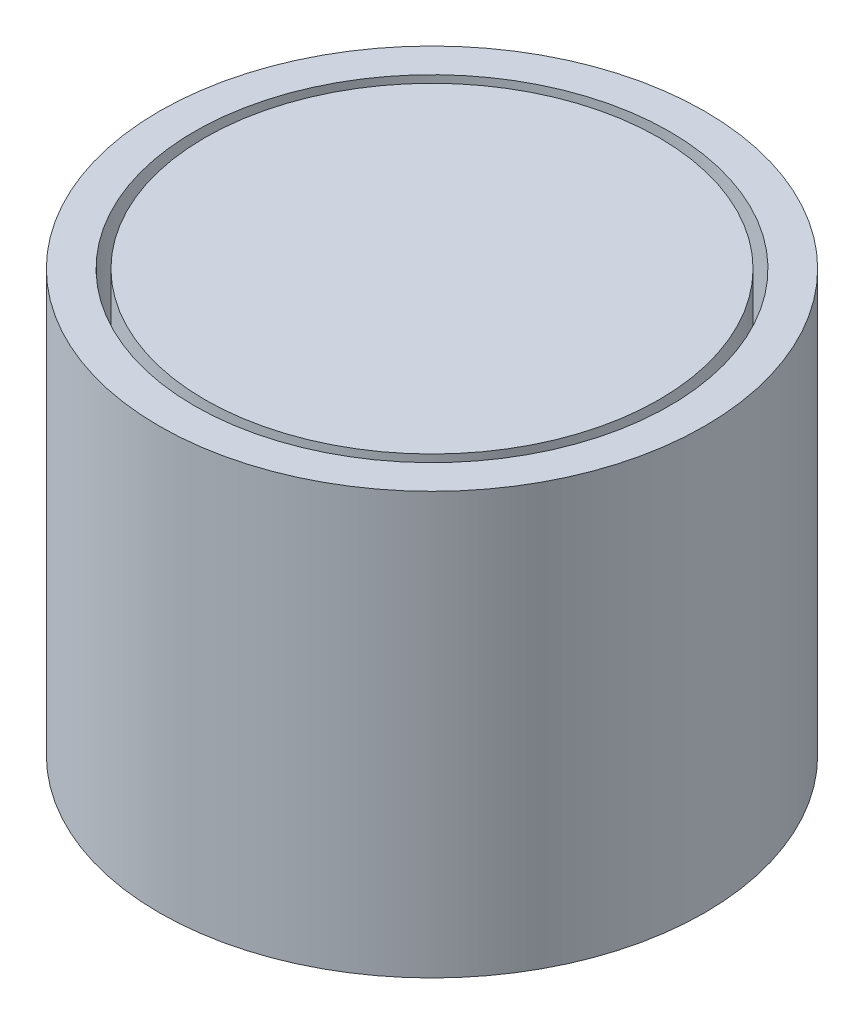
ISO-10303-21;
HEADER;
FILE_DESCRIPTION(('STEP AP214'),'2;1');
FILE_NAME('part.step','',(''),(''),'','','');
FILE_SCHEMA(('AUTOMOTIVE_DESIGN { 1 0 10303 214 1 1 1 1 }'));
ENDSEC;
DATA;
#1=APPLICATION_CONTEXT('core data for automotive mechanical design processes');
#2=APPLICATION_PROTOCOL_DEFINITION('international standard','automotive_design',2000,#1);
#3=PRODUCT_CONTEXT('',#1,'mechanical');
#4=PRODUCT('Part','Part','',(#3));
#5=PRODUCT_RELATED_PRODUCT_CATEGORY('part','',(#4));
#6=PRODUCT_DEFINITION_FORMATION('','',#4);
#7=PRODUCT_DEFINITION_CONTEXT('part definition',#1,'design');
#8=PRODUCT_DEFINITION('design','',#6,#7);
#9=PRODUCT_DEFINITION_SHAPE('','',#8);
#10=(LENGTH_UNIT() NAMED_UNIT(*) SI_UNIT(.MILLI.,.METRE.));
#11=(NAMED_UNIT(*) PLANE_ANGLE_UNIT() SI_UNIT($,.RADIAN.));
#12=(NAMED_UNIT(*) SI_UNIT($,.STERADIAN.) SOLID_ANGLE_UNIT());
#13=UNCERTAINTY_MEASURE_WITH_UNIT(LENGTH_MEASURE(1.E-05),#10,'distance_accuracy_value','');
#14=(GEOMETRIC_REPRESENTATION_CONTEXT(3) GLOBAL_UNCERTAINTY_ASSIGNED_CONTEXT((#13)) GLOBAL_UNIT_ASSIGNED_CONTEXT((#10,
#11,#12)) REPRESENTATION_CONTEXT('',''));
#15=CARTESIAN_POINT('',(0.,0.,0.));
#16=DIRECTION('',(0.,0.,1.));
#17=DIRECTION('',(1.,0.,0.));
#18=AXIS2_PLACEMENT_3D('',#15,#16,#17);
#19=CARTESIAN_POINT('',(0.,17.,0.));
#20=DIRECTION('',(0.,-1.,0.));
#21=DIRECTION('',(0.,0.,-1.));
#22=AXIS2_PLACEMENT_3D('',#19,#20,#21);
#23=CYLINDRICAL_SURFACE('',#22,11.);
#24=CARTESIAN_POINT('',(0.,17.,0.));
#25=DIRECTION('',(0.,1.,0.));
#26=DIRECTION('',(0.,0.,1.));
#27=AXIS2_PLACEMENT_3D('',#24,#25,#26);
#28=CIRCLE('',#27,11.);
#29=CARTESIAN_POINT('',(0.,17.,11.));
#30=VERTEX_POINT('',#29);
#31=EDGE_CURVE('E10',#30,#30,#28,.T.);
#32=ORIENTED_EDGE('',*,*,#31,.F.);
#33=EDGE_LOOP('',(#32));
#34=FACE_BOUND('',#33,.T.);
#35=CARTESIAN_POINT('',(0.,0.,0.));
#36=DIRECTION('',(0.,1.,0.));
#37=DIRECTION('',(0.,0.,1.));
#38=AXIS2_PLACEMENT_3D('',#35,#36,#37);
#39=CIRCLE('',#38,11.);
#40=CARTESIAN_POINT('',(0.,0.,11.));
#41=VERTEX_POINT('',#40);
#42=EDGE_CURVE('E35',#41,#41,#39,.T.);
#43=ORIENTED_EDGE('',*,*,#42,.T.);
#44=EDGE_LOOP('',(#43));
#45=FACE_BOUND('',#44,.T.);
#46=ADVANCED_FACE('F32',(#34,#45),#23,.T.);
#47=CARTESIAN_POINT('',(0.,17.,0.));
#48=DIRECTION('',(0.,1.,0.));
#49=DIRECTION('',(0.,0.,1.));
#50=AXIS2_PLACEMENT_3D('',#47,#48,#49);
#51=PLANE('',#50);
#52=CARTESIAN_POINT('',(0.,17.,0.));
#53=DIRECTION('',(0.,1.,0.));
#54=DIRECTION('',(0.,0.,1.));
#55=AXIS2_PLACEMENT_3D('',#52,#53,#54);
#56=CIRCLE('',#55,9.58286422537005);
#57=CARTESIAN_POINT('',(0.,17.,9.58286422537005));
#58=VERTEX_POINT('',#57);
#59=EDGE_CURVE('E44',#58,#58,#56,.T.);
#60=ORIENTED_EDGE('',*,*,#59,.F.);
#61=EDGE_LOOP('',(#60));
#62=FACE_BOUND('',#61,.T.);
#63=ORIENTED_EDGE('',*,*,#31,.T.);
#64=EDGE_LOOP('',(#63));
#65=FACE_BOUND('',#64,.T.);
#66=ADVANCED_FACE('F77',(#62,#65),#51,.T.);
#67=CARTESIAN_POINT('',(0.,0.,0.));
#68=DIRECTION('',(0.,1.,0.));
#69=DIRECTION('',(0.,0.,1.));
#70=AXIS2_PLACEMENT_3D('',#67,#68,#69);
#71=PLANE('',#70);
#72=ORIENTED_EDGE('',*,*,#42,.F.);
#73=EDGE_LOOP('',(#72));
#74=FACE_BOUND('',#73,.T.);
#75=ADVANCED_FACE('F73',(#74),#71,.F.);
#76=CARTESIAN_POINT('',(0.,1.,0.));
#77=DIRECTION('',(0.,1.,0.));
#78=DIRECTION('',(0.,0.,1.));
#79=AXIS2_PLACEMENT_3D('',#76,#77,#78);
#80=CYLINDRICAL_SURFACE('',#79,9.58286422537005);
#81=CARTESIAN_POINT('',(0.,1.,0.));
#82=DIRECTION('',(0.,1.,0.));
#83=DIRECTION('',(0.,0.,1.));
#84=AXIS2_PLACEMENT_3D('',#81,#82,#83);
#85=CIRCLE('',#84,9.58286422537005);
#86=CARTESIAN_POINT('',(0.,1.,9.58286422537005));
#87=VERTEX_POINT('',#86);
#88=EDGE_CURVE('E42',#87,#87,#85,.T.);
#89=ORIENTED_EDGE('',*,*,#88,.F.);
#90=EDGE_LOOP('',(#89));
#91=FACE_BOUND('',#90,.T.);
#92=ORIENTED_EDGE('',*,*,#59,.T.);
#93=EDGE_LOOP('',(#92));
#94=FACE_BOUND('',#93,.T.);
#95=ADVANCED_FACE('F67',(#91,#94),#80,.F.);
#96=CARTESIAN_POINT('',(0.,1.,0.));
#97=DIRECTION('',(0.,1.,0.));
#98=DIRECTION('',(0.,0.,1.));
#99=AXIS2_PLACEMENT_3D('',#96,#97,#98);
#100=PLANE('',#99);
#101=CARTESIAN_POINT('',(0.,1.,0.));
#102=DIRECTION('',(0.,1.,0.));
#103=DIRECTION('',(0.,0.,1.));
#104=AXIS2_PLACEMENT_3D('',#101,#102,#103);
#105=CIRCLE('',#104,9.15745431786933);
#106=CARTESIAN_POINT('',(0.,1.,9.15745431786933));
#107=VERTEX_POINT('',#106);
#108=EDGE_CURVE('E50',#107,#107,#105,.T.);
#109=ORIENTED_EDGE('',*,*,#108,.F.);
#110=EDGE_LOOP('',(#109));
#111=FACE_BOUND('',#110,.T.);
#112=ORIENTED_EDGE('',*,*,#88,.T.);
#113=EDGE_LOOP('',(#112));
#114=FACE_BOUND('',#113,.T.);
#115=ADVANCED_FACE('F61',(#111,#114),#100,.T.);
#116=CARTESIAN_POINT('',(0.,17.,0.));
#117=DIRECTION('',(0.,-1.,0.));
#118=DIRECTION('',(0.,0.,-1.));
#119=AXIS2_PLACEMENT_3D('',#116,#117,#118);
#120=CYLINDRICAL_SURFACE('',#119,9.15745431786933);
#121=CARTESIAN_POINT('',(0.,17.,0.));
#122=DIRECTION('',(0.,1.,0.));
#123=DIRECTION('',(0.,0.,1.));
#124=AXIS2_PLACEMENT_3D('',#121,#122,#123);
#125=CIRCLE('',#124,9.15745431786933);
#126=CARTESIAN_POINT('',(0.,17.,9.15745431786933));
#127=VERTEX_POINT('',#126);
#128=EDGE_CURVE('E47',#127,#127,#125,.T.);
#129=ORIENTED_EDGE('',*,*,#128,.F.);
#130=EDGE_LOOP('',(#129));
#131=FACE_BOUND('',#130,.T.);
#132=ORIENTED_EDGE('',*,*,#108,.T.);
#133=EDGE_LOOP('',(#132));
#134=FACE_BOUND('',#133,.T.);
#135=ADVANCED_FACE('F58',(#131,#134),#120,.T.);
#136=CARTESIAN_POINT('',(0.,17.,0.));
#137=DIRECTION('',(0.,1.,0.));
#138=DIRECTION('',(0.,0.,1.));
#139=AXIS2_PLACEMENT_3D('',#136,#137,#138);
#140=PLANE('',#139);
#141=ORIENTED_EDGE('',*,*,#128,.T.);
#142=EDGE_LOOP('',(#141));
#143=FACE_BOUND('',#142,.T.);
#144=ADVANCED_FACE('F56',(#143),#140,.T.);
#145=CLOSED_SHELL('',(#46,#66,#75,#95,#115,#135,#144));
#146=MANIFOLD_SOLID_BREP('B2',#145);
#147=ADVANCED_BREP_SHAPE_REPRESENTATION('',(#18,#146),#14);
#148=SHAPE_DEFINITION_REPRESENTATION(#9,#147);
ENDSEC;
END-ISO-10303-21;
